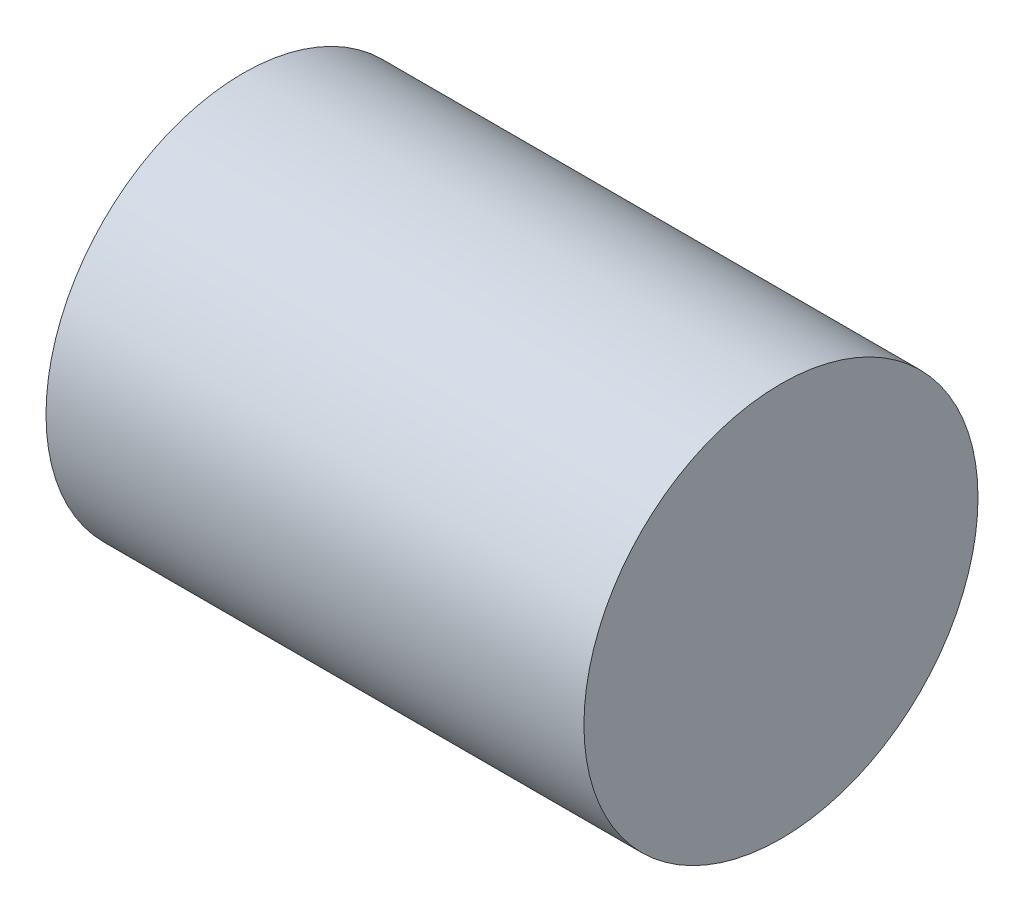
ISO-10303-21;
HEADER;
FILE_DESCRIPTION(('STEP AP214'),'2;1');
FILE_NAME('part.step','',(''),(''),'','','');
FILE_SCHEMA(('AUTOMOTIVE_DESIGN { 1 0 10303 214 1 1 1 1 }'));
ENDSEC;
DATA;
#1=APPLICATION_CONTEXT('core data for automotive mechanical design processes');
#2=APPLICATION_PROTOCOL_DEFINITION('international standard','automotive_design',2000,#1);
#3=PRODUCT_CONTEXT('',#1,'mechanical');
#4=PRODUCT('Part','Part','',(#3));
#5=PRODUCT_RELATED_PRODUCT_CATEGORY('part','',(#4));
#6=PRODUCT_DEFINITION_FORMATION('','',#4);
#7=PRODUCT_DEFINITION_CONTEXT('part definition',#1,'design');
#8=PRODUCT_DEFINITION('design','',#6,#7);
#9=PRODUCT_DEFINITION_SHAPE('','',#8);
#10=(LENGTH_UNIT() NAMED_UNIT(*) SI_UNIT(.MILLI.,.METRE.));
#11=(NAMED_UNIT(*) PLANE_ANGLE_UNIT() SI_UNIT($,.RADIAN.));
#12=(NAMED_UNIT(*) SI_UNIT($,.STERADIAN.) SOLID_ANGLE_UNIT());
#13=UNCERTAINTY_MEASURE_WITH_UNIT(LENGTH_MEASURE(1.E-05),#10,'distance_accuracy_value','');
#14=(GEOMETRIC_REPRESENTATION_CONTEXT(3) GLOBAL_UNCERTAINTY_ASSIGNED_CONTEXT((#13)) GLOBAL_UNIT_ASSIGNED_CONTEXT((#10,
#11,#12)) REPRESENTATION_CONTEXT('',''));
#15=CARTESIAN_POINT('',(0.,0.,0.));
#16=DIRECTION('',(0.,0.,1.));
#17=DIRECTION('',(1.,0.,0.));
#18=AXIS2_PLACEMENT_3D('',#15,#16,#17);
#19=CARTESIAN_POINT('',(21.844,0.,0.));
#20=DIRECTION('',(-1.,0.,0.));
#21=DIRECTION('',(0.,0.,1.));
#22=AXIS2_PLACEMENT_3D('',#19,#20,#21);
#23=CYLINDRICAL_SURFACE('',#22,16.002);
#24=CARTESIAN_POINT('',(21.844,0.,0.));
#25=DIRECTION('',(1.,0.,0.));
#26=DIRECTION('',(0.,0.,-1.));
#27=AXIS2_PLACEMENT_3D('',#24,#25,#26);
#28=CIRCLE('',#27,16.002);
#29=CARTESIAN_POINT('',(21.844,0.,-16.002));
#30=VERTEX_POINT('',#29);
#31=EDGE_CURVE('E10',#30,#30,#28,.T.);
#32=ORIENTED_EDGE('',*,*,#31,.F.);
#33=EDGE_LOOP('',(#32));
#34=FACE_BOUND('',#33,.T.);
#35=CARTESIAN_POINT('',(-21.844,0.,0.));
#36=DIRECTION('',(1.,0.,0.));
#37=DIRECTION('',(0.,0.,-1.));
#38=AXIS2_PLACEMENT_3D('',#35,#36,#37);
#39=CIRCLE('',#38,16.002);
#40=CARTESIAN_POINT('',(-21.844,0.,-16.002));
#41=VERTEX_POINT('',#40);
#42=EDGE_CURVE('E40',#41,#41,#39,.T.);
#43=ORIENTED_EDGE('',*,*,#42,.T.);
#44=EDGE_LOOP('',(#43));
#45=FACE_BOUND('',#44,.T.);
#46=ADVANCED_FACE('F37',(#34,#45),#23,.T.);
#47=CARTESIAN_POINT('',(21.844,0.,0.));
#48=DIRECTION('',(1.,0.,0.));
#49=DIRECTION('',(0.,0.,-1.));
#50=AXIS2_PLACEMENT_3D('',#47,#48,#49);
#51=PLANE('',#50);
#52=ORIENTED_EDGE('',*,*,#31,.T.);
#53=EDGE_LOOP('',(#52));
#54=FACE_BOUND('',#53,.T.);
#55=ADVANCED_FACE('F54',(#54),#51,.T.);
#56=CARTESIAN_POINT('',(-21.844,0.,0.));
#57=DIRECTION('',(1.,0.,0.));
#58=DIRECTION('',(0.,0.,-1.));
#59=AXIS2_PLACEMENT_3D('',#56,#57,#58);
#60=PLANE('',#59);
#61=ORIENTED_EDGE('',*,*,#42,.F.);
#62=EDGE_LOOP('',(#61));
#63=FACE_BOUND('',#62,.T.);
#64=ADVANCED_FACE('F52',(#63),#60,.F.);
#65=CLOSED_SHELL('',(#46,#55,#64));
#66=MANIFOLD_SOLID_BREP('B2',#65);
#67=ADVANCED_BREP_SHAPE_REPRESENTATION('',(#18,#66),#14);
#68=SHAPE_DEFINITION_REPRESENTATION(#9,#67);
ENDSEC;
END-ISO-10303-21;
